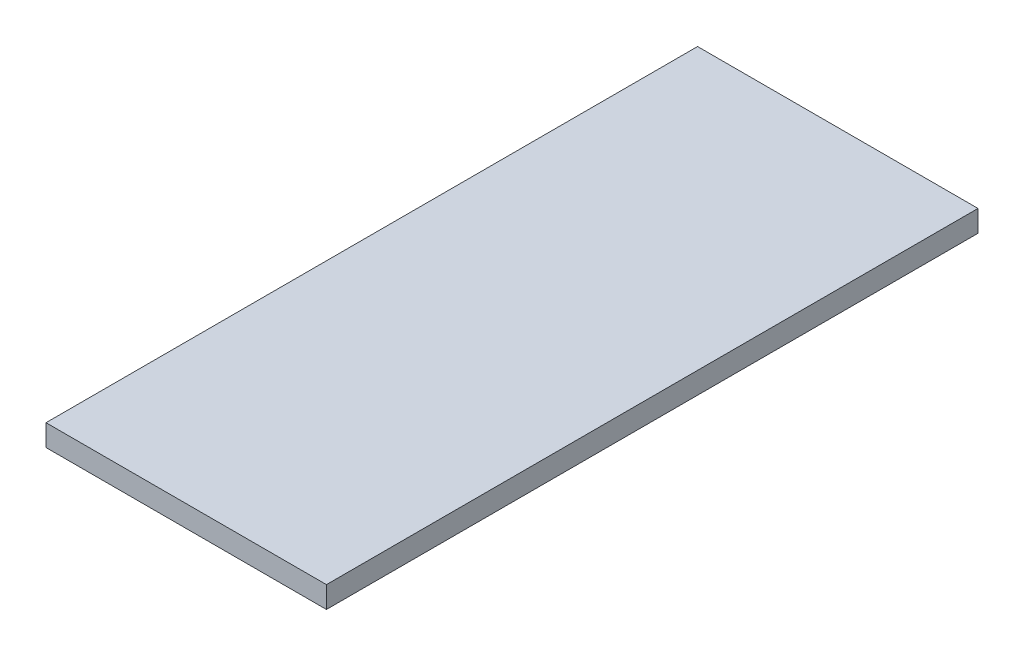
ISO-10303-21;
HEADER;
FILE_DESCRIPTION(('STEP AP214'),'2;1');
FILE_NAME('part.step','',(''),(''),'','','');
FILE_SCHEMA(('AUTOMOTIVE_DESIGN { 1 0 10303 214 1 1 1 1 }'));
ENDSEC;
DATA;
#1=APPLICATION_CONTEXT('core data for automotive mechanical design processes');
#2=APPLICATION_PROTOCOL_DEFINITION('international standard','automotive_design',2000,#1);
#3=PRODUCT_CONTEXT('',#1,'mechanical');
#4=PRODUCT('Part','Part','',(#3));
#5=PRODUCT_RELATED_PRODUCT_CATEGORY('part','',(#4));
#6=PRODUCT_DEFINITION_FORMATION('','',#4);
#7=PRODUCT_DEFINITION_CONTEXT('part definition',#1,'design');
#8=PRODUCT_DEFINITION('design','',#6,#7);
#9=PRODUCT_DEFINITION_SHAPE('','',#8);
#10=(LENGTH_UNIT() NAMED_UNIT(*) SI_UNIT(.MILLI.,.METRE.));
#11=(NAMED_UNIT(*) PLANE_ANGLE_UNIT() SI_UNIT($,.RADIAN.));
#12=(NAMED_UNIT(*) SI_UNIT($,.STERADIAN.) SOLID_ANGLE_UNIT());
#13=UNCERTAINTY_MEASURE_WITH_UNIT(LENGTH_MEASURE(1.E-05),#10,'distance_accuracy_value','');
#14=(GEOMETRIC_REPRESENTATION_CONTEXT(3) GLOBAL_UNCERTAINTY_ASSIGNED_CONTEXT((#13)) GLOBAL_UNIT_ASSIGNED_CONTEXT((#10,
#11,#12)) REPRESENTATION_CONTEXT('',''));
#15=CARTESIAN_POINT('',(0.,0.,0.));
#16=DIRECTION('',(0.,0.,1.));
#17=DIRECTION('',(1.,0.,0.));
#18=AXIS2_PLACEMENT_3D('',#15,#16,#17);
#19=CARTESIAN_POINT('',(0.,20.,0.));
#20=DIRECTION('',(1.,0.,0.));
#21=DIRECTION('',(0.,0.,-1.));
#22=AXIS2_PLACEMENT_3D('',#19,#20,#21);
#23=PLANE('',#22);
#24=DIRECTION('',(0.,0.,1.));
#25=VECTOR('',#24,1.);
#26=CARTESIAN_POINT('',(0.,0.,0.));
#27=LINE('',#26,#25);
#28=CARTESIAN_POINT('',(0.,0.,-605.));
#29=VERTEX_POINT('',#28);
#30=CARTESIAN_POINT('',(0.,0.,0.));
#31=VERTEX_POINT('',#30);
#32=EDGE_CURVE('E97',#29,#31,#27,.T.);
#33=ORIENTED_EDGE('',*,*,#32,.T.);
#34=DIRECTION('',(0.,-1.,0.));
#35=VECTOR('',#34,1.);
#36=CARTESIAN_POINT('',(0.,20.,0.));
#37=LINE('',#36,#35);
#38=CARTESIAN_POINT('',(0.,20.,0.));
#39=VERTEX_POINT('',#38);
#40=EDGE_CURVE('E11',#39,#31,#37,.T.);
#41=ORIENTED_EDGE('',*,*,#40,.F.);
#42=DIRECTION('',(0.,0.,1.));
#43=VECTOR('',#42,1.);
#44=CARTESIAN_POINT('',(0.,20.,0.));
#45=LINE('',#44,#43);
#46=CARTESIAN_POINT('',(0.,20.,-605.));
#47=VERTEX_POINT('',#46);
#48=EDGE_CURVE('E85',#47,#39,#45,.T.);
#49=ORIENTED_EDGE('',*,*,#48,.F.);
#50=DIRECTION('',(0.,-1.,0.));
#51=VECTOR('',#50,1.);
#52=CARTESIAN_POINT('',(0.,20.,-605.));
#53=LINE('',#52,#51);
#54=EDGE_CURVE('E93',#47,#29,#53,.T.);
#55=ORIENTED_EDGE('',*,*,#54,.T.);
#56=EDGE_LOOP('',(#33,#41,#49,#55));
#57=FACE_BOUND('',#56,.T.);
#58=ADVANCED_FACE('F34',(#57),#23,.F.);
#59=CARTESIAN_POINT('',(0.,20.,0.));
#60=DIRECTION('',(0.,0.,-1.));
#61=DIRECTION('',(-1.,0.,0.));
#62=AXIS2_PLACEMENT_3D('',#59,#60,#61);
#63=PLANE('',#62);
#64=DIRECTION('',(1.,0.,0.));
#65=VECTOR('',#64,1.);
#66=CARTESIAN_POINT('',(0.,0.,0.));
#67=LINE('',#66,#65);
#68=CARTESIAN_POINT('',(260.4,0.,0.));
#69=VERTEX_POINT('',#68);
#70=EDGE_CURVE('E89',#31,#69,#67,.T.);
#71=ORIENTED_EDGE('',*,*,#70,.T.);
#72=DIRECTION('',(0.,-1.,0.));
#73=VECTOR('',#72,1.);
#74=CARTESIAN_POINT('',(260.4,20.,0.));
#75=LINE('',#74,#73);
#76=CARTESIAN_POINT('',(260.4,20.,0.));
#77=VERTEX_POINT('',#76);
#78=EDGE_CURVE('E42',#77,#69,#75,.T.);
#79=ORIENTED_EDGE('',*,*,#78,.F.);
#80=DIRECTION('',(1.,0.,0.));
#81=VECTOR('',#80,1.);
#82=CARTESIAN_POINT('',(0.,20.,0.));
#83=LINE('',#82,#81);
#84=EDGE_CURVE('E80',#39,#77,#83,.T.);
#85=ORIENTED_EDGE('',*,*,#84,.F.);
#86=ORIENTED_EDGE('',*,*,#40,.T.);
#87=EDGE_LOOP('',(#71,#79,#85,#86));
#88=FACE_BOUND('',#87,.T.);
#89=ADVANCED_FACE('F88',(#88),#63,.F.);
#90=CARTESIAN_POINT('',(260.4,20.,0.));
#91=DIRECTION('',(-1.,0.,0.));
#92=DIRECTION('',(0.,0.,1.));
#93=AXIS2_PLACEMENT_3D('',#90,#91,#92);
#94=PLANE('',#93);
#95=DIRECTION('',(0.,0.,-1.));
#96=VECTOR('',#95,1.);
#97=CARTESIAN_POINT('',(260.4,0.,0.));
#98=LINE('',#97,#96);
#99=CARTESIAN_POINT('',(260.4,0.,-605.));
#100=VERTEX_POINT('',#99);
#101=EDGE_CURVE('E67',#69,#100,#98,.T.);
#102=ORIENTED_EDGE('',*,*,#101,.T.);
#103=DIRECTION('',(0.,-1.,0.));
#104=VECTOR('',#103,1.);
#105=CARTESIAN_POINT('',(260.4,20.,-605.));
#106=LINE('',#105,#104);
#107=CARTESIAN_POINT('',(260.4,20.,-605.));
#108=VERTEX_POINT('',#107);
#109=EDGE_CURVE('E90',#108,#100,#106,.T.);
#110=ORIENTED_EDGE('',*,*,#109,.F.);
#111=DIRECTION('',(0.,0.,-1.));
#112=VECTOR('',#111,1.);
#113=CARTESIAN_POINT('',(260.4,20.,0.));
#114=LINE('',#113,#112);
#115=EDGE_CURVE('E83',#77,#108,#114,.T.);
#116=ORIENTED_EDGE('',*,*,#115,.F.);
#117=ORIENTED_EDGE('',*,*,#78,.T.);
#118=EDGE_LOOP('',(#102,#110,#116,#117));
#119=FACE_BOUND('',#118,.T.);
#120=ADVANCED_FACE('F91',(#119),#94,.F.);
#121=CARTESIAN_POINT('',(0.,20.,-605.));
#122=DIRECTION('',(0.,0.,1.));
#123=DIRECTION('',(1.,0.,0.));
#124=AXIS2_PLACEMENT_3D('',#121,#122,#123);
#125=PLANE('',#124);
#126=DIRECTION('',(-1.,0.,0.));
#127=VECTOR('',#126,1.);
#128=CARTESIAN_POINT('',(0.,0.,-605.));
#129=LINE('',#128,#127);
#130=EDGE_CURVE('E73',#100,#29,#129,.T.);
#131=ORIENTED_EDGE('',*,*,#130,.T.);
#132=ORIENTED_EDGE('',*,*,#54,.F.);
#133=DIRECTION('',(-1.,0.,0.));
#134=VECTOR('',#133,1.);
#135=CARTESIAN_POINT('',(0.,20.,-605.));
#136=LINE('',#135,#134);
#137=EDGE_CURVE('E50',#108,#47,#136,.T.);
#138=ORIENTED_EDGE('',*,*,#137,.F.);
#139=ORIENTED_EDGE('',*,*,#109,.T.);
#140=EDGE_LOOP('',(#131,#132,#138,#139));
#141=FACE_BOUND('',#140,.T.);
#142=ADVANCED_FACE('F104',(#141),#125,.F.);
#143=CARTESIAN_POINT('',(0.,20.,0.));
#144=DIRECTION('',(0.,-1.,0.));
#145=DIRECTION('',(0.,0.,-1.));
#146=AXIS2_PLACEMENT_3D('',#143,#144,#145);
#147=PLANE('',#146);
#148=ORIENTED_EDGE('',*,*,#48,.T.);
#149=ORIENTED_EDGE('',*,*,#84,.T.);
#150=ORIENTED_EDGE('',*,*,#115,.T.);
#151=ORIENTED_EDGE('',*,*,#137,.T.);
#152=EDGE_LOOP('',(#148,#149,#150,#151));
#153=FACE_BOUND('',#152,.T.);
#154=ADVANCED_FACE('F81',(#153),#147,.F.);
#155=CARTESIAN_POINT('',(0.,0.,0.));
#156=DIRECTION('',(0.,-1.,0.));
#157=DIRECTION('',(0.,0.,-1.));
#158=AXIS2_PLACEMENT_3D('',#155,#156,#157);
#159=PLANE('',#158);
#160=ORIENTED_EDGE('',*,*,#32,.F.);
#161=ORIENTED_EDGE('',*,*,#130,.F.);
#162=ORIENTED_EDGE('',*,*,#101,.F.);
#163=ORIENTED_EDGE('',*,*,#70,.F.);
#164=EDGE_LOOP('',(#160,#161,#162,#163));
#165=FACE_BOUND('',#164,.T.);
#166=ADVANCED_FACE('F107',(#165),#159,.T.);
#167=CLOSED_SHELL('',(#58,#89,#120,#142,#154,#166));
#168=MANIFOLD_SOLID_BREP('B2',#167);
#169=ADVANCED_BREP_SHAPE_REPRESENTATION('',(#18,#168),#14);
#170=SHAPE_DEFINITION_REPRESENTATION(#9,#169);
ENDSEC;
END-ISO-10303-21;
